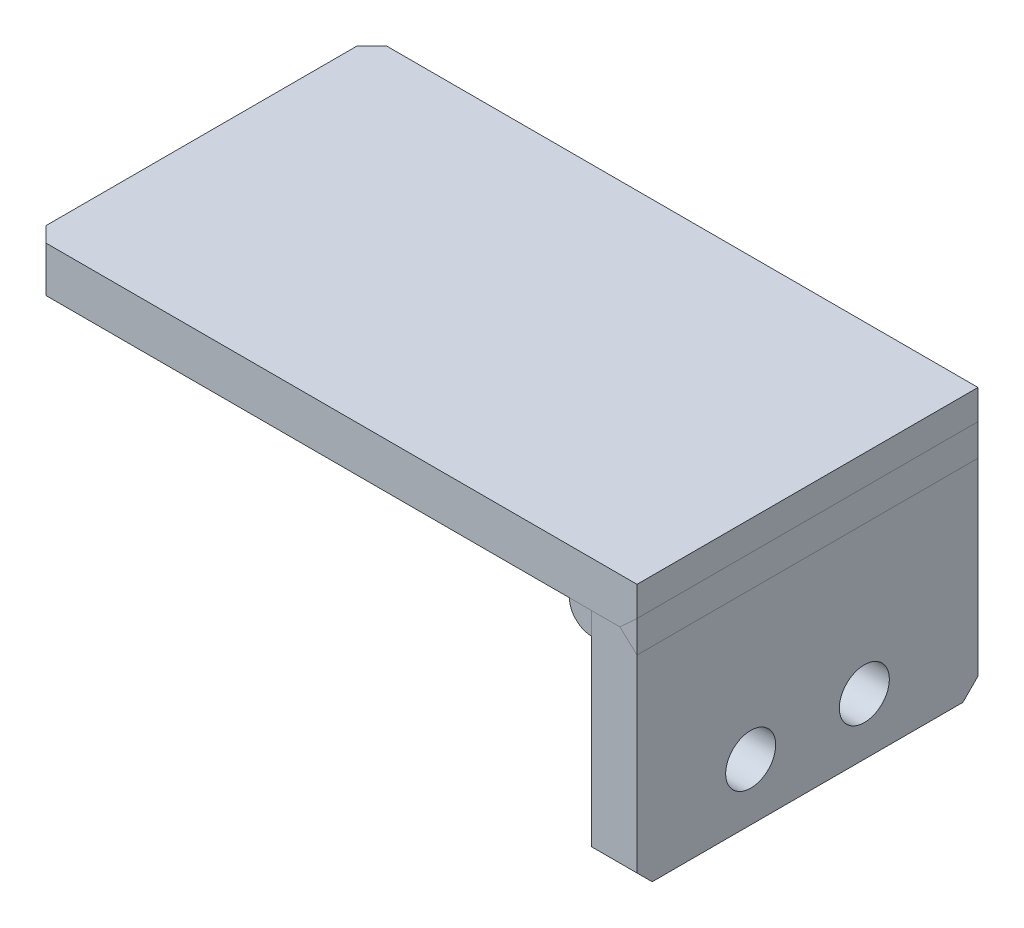
ISO-10303-21;
HEADER;
FILE_DESCRIPTION(('STEP AP214'),'2;1');
FILE_NAME('part.step','',(''),(''),'','','');
FILE_SCHEMA(('AUTOMOTIVE_DESIGN { 1 0 10303 214 1 1 1 1 }'));
ENDSEC;
DATA;
#1=APPLICATION_CONTEXT('core data for automotive mechanical design processes');
#2=APPLICATION_PROTOCOL_DEFINITION('international standard','automotive_design',2000,#1);
#3=PRODUCT_CONTEXT('',#1,'mechanical');
#4=PRODUCT('Part','Part','',(#3));
#5=PRODUCT_RELATED_PRODUCT_CATEGORY('part','',(#4));
#6=PRODUCT_DEFINITION_FORMATION('','',#4);
#7=PRODUCT_DEFINITION_CONTEXT('part definition',#1,'design');
#8=PRODUCT_DEFINITION('design','',#6,#7);
#9=PRODUCT_DEFINITION_SHAPE('','',#8);
#10=(LENGTH_UNIT() NAMED_UNIT(*) SI_UNIT(.MILLI.,.METRE.));
#11=(NAMED_UNIT(*) PLANE_ANGLE_UNIT() SI_UNIT($,.RADIAN.));
#12=(NAMED_UNIT(*) SI_UNIT($,.STERADIAN.) SOLID_ANGLE_UNIT());
#13=UNCERTAINTY_MEASURE_WITH_UNIT(LENGTH_MEASURE(1.E-05),#10,'distance_accuracy_value','');
#14=(GEOMETRIC_REPRESENTATION_CONTEXT(3) GLOBAL_UNCERTAINTY_ASSIGNED_CONTEXT((#13)) GLOBAL_UNIT_ASSIGNED_CONTEXT((#10,
#11,#12)) REPRESENTATION_CONTEXT('',''));
#15=CARTESIAN_POINT('',(0.,0.,0.));
#16=DIRECTION('',(0.,0.,1.));
#17=DIRECTION('',(1.,0.,0.));
#18=AXIS2_PLACEMENT_3D('',#15,#16,#17);
#19=CARTESIAN_POINT('',(77.7328439496423,-6.,-45.));
#20=DIRECTION('',(-0.678446943130279,0.734649403019685,0.));
#21=DIRECTION('',(-0.734649403019685,-0.678446943130279,0.));
#22=AXIS2_PLACEMENT_3D('',#19,#20,#21);
#23=PLANE('',#22);
#24=DIRECTION('',(-0.734649403019685,-0.678446943130279,0.));
#25=VECTOR('',#24,1.);
#26=CARTESIAN_POINT('',(77.7328439496423,-6.,0.));
#27=LINE('',#26,#25);
#28=CARTESIAN_POINT('',(80.,-3.90628688236577,0.));
#29=VERTEX_POINT('',#28);
#30=CARTESIAN_POINT('',(77.7328439496423,-6.,0.));
#31=VERTEX_POINT('',#30);
#32=EDGE_CURVE('E104',#29,#31,#27,.T.);
#33=ORIENTED_EDGE('',*,*,#32,.F.);
#34=DIRECTION('',(0.,0.,1.));
#35=VECTOR('',#34,1.);
#36=CARTESIAN_POINT('',(80.,-3.90628688236577,-45.));
#37=LINE('',#36,#35);
#38=CARTESIAN_POINT('',(80.,-3.90628688236577,-45.));
#39=VERTEX_POINT('',#38);
#40=EDGE_CURVE('E12',#39,#29,#37,.T.);
#41=ORIENTED_EDGE('',*,*,#40,.F.);
#42=DIRECTION('',(-0.734649403019685,-0.678446943130279,0.));
#43=VECTOR('',#42,1.);
#44=CARTESIAN_POINT('',(77.7328439496423,-6.,-45.));
#45=LINE('',#44,#43);
#46=CARTESIAN_POINT('',(77.7328439496423,-6.,-45.));
#47=VERTEX_POINT('',#46);
#48=EDGE_CURVE('E96',#39,#47,#45,.T.);
#49=ORIENTED_EDGE('',*,*,#48,.T.);
#50=DIRECTION('',(0.,0.,1.));
#51=VECTOR('',#50,1.);
#52=CARTESIAN_POINT('',(77.7328439496423,-6.,-45.));
#53=LINE('',#52,#51);
#54=EDGE_CURVE('E55',#47,#31,#53,.T.);
#55=ORIENTED_EDGE('',*,*,#54,.T.);
#56=EDGE_LOOP('',(#33,#41,#49,#55));
#57=FACE_BOUND('',#56,.T.);
#58=ADVANCED_FACE('F52',(#57),#23,.T.);
#59=CARTESIAN_POINT('',(80.,-3.90628688236577,-45.));
#60=DIRECTION('',(1.,0.,0.));
#61=DIRECTION('',(0.,0.,-1.));
#62=AXIS2_PLACEMENT_3D('',#59,#60,#61);
#63=PLANE('',#62);
#64=DIRECTION('',(0.,1.,0.));
#65=VECTOR('',#64,1.);
#66=CARTESIAN_POINT('',(80.,-3.90628688236577,0.));
#67=LINE('',#66,#65);
#68=CARTESIAN_POINT('',(80.,-8.08518038697702,0.));
#69=VERTEX_POINT('',#68);
#70=EDGE_CURVE('E98',#69,#29,#67,.T.);
#71=ORIENTED_EDGE('',*,*,#70,.F.);
#72=DIRECTION('',(0.,0.,1.));
#73=VECTOR('',#72,1.);
#74=CARTESIAN_POINT('',(80.,-8.08518038697702,-45.));
#75=LINE('',#74,#73);
#76=CARTESIAN_POINT('',(80.,-8.08518038697702,-45.));
#77=VERTEX_POINT('',#76);
#78=EDGE_CURVE('E61',#77,#69,#75,.T.);
#79=ORIENTED_EDGE('',*,*,#78,.F.);
#80=DIRECTION('',(0.,1.,0.));
#81=VECTOR('',#80,1.);
#82=CARTESIAN_POINT('',(80.,-3.90628688236577,-45.));
#83=LINE('',#82,#81);
#84=EDGE_CURVE('E93',#77,#39,#83,.T.);
#85=ORIENTED_EDGE('',*,*,#84,.T.);
#86=ORIENTED_EDGE('',*,*,#40,.T.);
#87=EDGE_LOOP('',(#71,#79,#85,#86));
#88=FACE_BOUND('',#87,.T.);
#89=ADVANCED_FACE('F108',(#88),#63,.T.);
#90=CARTESIAN_POINT('',(80.,-8.08518038697702,-45.));
#91=DIRECTION('',(-0.67695046810947,-0.736028575346344,0.));
#92=DIRECTION('',(0.736028575346344,-0.67695046810947,0.));
#93=AXIS2_PLACEMENT_3D('',#90,#91,#92);
#94=PLANE('',#93);
#95=DIRECTION('',(0.736028575346344,-0.67695046810947,0.));
#96=VECTOR('',#95,1.);
#97=CARTESIAN_POINT('',(80.,-8.08518038697702,0.));
#98=LINE('',#97,#96);
#99=EDGE_CURVE('E91',#31,#69,#98,.T.);
#100=ORIENTED_EDGE('',*,*,#99,.F.);
#101=ORIENTED_EDGE('',*,*,#54,.F.);
#102=DIRECTION('',(0.736028575346344,-0.67695046810947,0.));
#103=VECTOR('',#102,1.);
#104=CARTESIAN_POINT('',(80.,-8.08518038697702,-45.));
#105=LINE('',#104,#103);
#106=EDGE_CURVE('E89',#47,#77,#105,.T.);
#107=ORIENTED_EDGE('',*,*,#106,.T.);
#108=ORIENTED_EDGE('',*,*,#78,.T.);
#109=EDGE_LOOP('',(#100,#101,#107,#108));
#110=FACE_BOUND('',#109,.T.);
#111=ADVANCED_FACE('F88',(#110),#94,.T.);
#112=CARTESIAN_POINT('',(0.,0.,-45.));
#113=DIRECTION('',(0.,0.,1.));
#114=DIRECTION('',(1.,0.,0.));
#115=AXIS2_PLACEMENT_3D('',#112,#113,#114);
#116=PLANE('',#115);
#117=ORIENTED_EDGE('',*,*,#48,.F.);
#118=ORIENTED_EDGE('',*,*,#84,.F.);
#119=ORIENTED_EDGE('',*,*,#106,.F.);
#120=EDGE_LOOP('',(#117,#118,#119));
#121=FACE_BOUND('',#120,.T.);
#122=ADVANCED_FACE('F95',(#121),#116,.F.);
#123=CARTESIAN_POINT('',(0.,0.,0.));
#124=DIRECTION('',(0.,0.,1.));
#125=DIRECTION('',(1.,0.,0.));
#126=AXIS2_PLACEMENT_3D('',#123,#124,#125);
#127=PLANE('',#126);
#128=ORIENTED_EDGE('',*,*,#32,.T.);
#129=ORIENTED_EDGE('',*,*,#99,.T.);
#130=ORIENTED_EDGE('',*,*,#70,.T.);
#131=EDGE_LOOP('',(#128,#129,#130));
#132=FACE_BOUND('',#131,.T.);
#133=ADVANCED_FACE('F107',(#132),#127,.T.);
#134=CLOSED_SHELL('',(#58,#89,#111,#122,#133));
#135=MANIFOLD_SOLID_BREP('B2',#134);
#136=CARTESIAN_POINT('',(71.0801171016969,-6.,-45.));
#137=DIRECTION('',(0.,1.,0.));
#138=DIRECTION('',(0.,0.,1.));
#139=AXIS2_PLACEMENT_3D('',#136,#137,#138);
#140=PLANE('',#139);
#141=DIRECTION('',(-1.,0.,0.));
#142=VECTOR('',#141,1.);
#143=CARTESIAN_POINT('',(71.0801171016969,-6.,0.));
#144=LINE('',#143,#142);
#145=CARTESIAN_POINT('',(74.,-6.,0.));
#146=VERTEX_POINT('',#145);
#147=CARTESIAN_POINT('',(71.0801171016969,-6.,0.));
#148=VERTEX_POINT('',#147);
#149=EDGE_CURVE('E212',#146,#148,#144,.T.);
#150=ORIENTED_EDGE('',*,*,#149,.F.);
#151=DIRECTION('',(0.,0.,1.));
#152=VECTOR('',#151,1.);
#153=CARTESIAN_POINT('',(74.,-6.,-45.));
#154=LINE('',#153,#152);
#155=CARTESIAN_POINT('',(74.,-6.,-45.));
#156=VERTEX_POINT('',#155);
#157=EDGE_CURVE('E50',#156,#146,#154,.T.);
#158=ORIENTED_EDGE('',*,*,#157,.F.);
#159=DIRECTION('',(-1.,0.,0.));
#160=VECTOR('',#159,1.);
#161=CARTESIAN_POINT('',(71.0801171016969,-6.,-45.));
#162=LINE('',#161,#160);
#163=CARTESIAN_POINT('',(71.0801171016969,-6.,-45.));
#164=VERTEX_POINT('',#163);
#165=EDGE_CURVE('E204',#156,#164,#162,.T.);
#166=ORIENTED_EDGE('',*,*,#165,.T.);
#167=DIRECTION('',(0.,0.,1.));
#168=VECTOR('',#167,1.);
#169=CARTESIAN_POINT('',(71.0801171016969,-6.,-45.));
#170=LINE('',#169,#168);
#171=EDGE_CURVE('E163',#164,#148,#170,.T.);
#172=ORIENTED_EDGE('',*,*,#171,.T.);
#173=EDGE_LOOP('',(#150,#158,#166,#172));
#174=FACE_BOUND('',#173,.T.);
#175=ADVANCED_FACE('F160',(#174),#140,.T.);
#176=CARTESIAN_POINT('',(74.,-8.91988289830308,-45.));
#177=DIRECTION('',(1.,0.,0.));
#178=DIRECTION('',(0.,0.,-1.));
#179=AXIS2_PLACEMENT_3D('',#176,#177,#178);
#180=PLANE('',#179);
#181=DIRECTION('',(0.,1.,0.));
#182=VECTOR('',#181,1.);
#183=CARTESIAN_POINT('',(74.,-8.91988289830308,0.));
#184=LINE('',#183,#182);
#185=CARTESIAN_POINT('',(74.,-8.91988289830308,0.));
#186=VERTEX_POINT('',#185);
#187=EDGE_CURVE('E206',#186,#146,#184,.T.);
#188=ORIENTED_EDGE('',*,*,#187,.F.);
#189=DIRECTION('',(0.,0.,1.));
#190=VECTOR('',#189,1.);
#191=CARTESIAN_POINT('',(74.,-8.91988289830308,-45.));
#192=LINE('',#191,#190);
#193=CARTESIAN_POINT('',(74.,-8.91988289830308,-45.));
#194=VERTEX_POINT('',#193);
#195=EDGE_CURVE('E169',#194,#186,#192,.T.);
#196=ORIENTED_EDGE('',*,*,#195,.F.);
#197=DIRECTION('',(0.,1.,0.));
#198=VECTOR('',#197,1.);
#199=CARTESIAN_POINT('',(74.,-8.91988289830308,-45.));
#200=LINE('',#199,#198);
#201=EDGE_CURVE('E201',#194,#156,#200,.T.);
#202=ORIENTED_EDGE('',*,*,#201,.T.);
#203=ORIENTED_EDGE('',*,*,#157,.T.);
#204=EDGE_LOOP('',(#188,#196,#202,#203));
#205=FACE_BOUND('',#204,.T.);
#206=ADVANCED_FACE('F216',(#205),#180,.T.);
#207=CARTESIAN_POINT('',(74.,-6.,-45.));
#208=DIRECTION('',(0.,0.,1.));
#209=DIRECTION('',(1.,0.,0.));
#210=AXIS2_PLACEMENT_3D('',#207,#208,#209);
#211=CYLINDRICAL_SURFACE('',#210,2.91988289830307);
#212=CARTESIAN_POINT('',(74.,-6.,0.));
#213=DIRECTION('',(0.,0.,1.));
#214=DIRECTION('',(1.,0.,0.));
#215=AXIS2_PLACEMENT_3D('',#212,#213,#214);
#216=CIRCLE('',#215,2.91988289830307);
#217=EDGE_CURVE('E199',#148,#186,#216,.T.);
#218=ORIENTED_EDGE('',*,*,#217,.F.);
#219=ORIENTED_EDGE('',*,*,#171,.F.);
#220=CARTESIAN_POINT('',(74.,-6.,-45.));
#221=DIRECTION('',(0.,0.,1.));
#222=DIRECTION('',(1.,0.,0.));
#223=AXIS2_PLACEMENT_3D('',#220,#221,#222);
#224=CIRCLE('',#223,2.91988289830307);
#225=EDGE_CURVE('E197',#164,#194,#224,.T.);
#226=ORIENTED_EDGE('',*,*,#225,.T.);
#227=ORIENTED_EDGE('',*,*,#195,.T.);
#228=EDGE_LOOP('',(#218,#219,#226,#227));
#229=FACE_BOUND('',#228,.T.);
#230=ADVANCED_FACE('F196',(#229),#211,.T.);
#231=CARTESIAN_POINT('',(74.,-6.,-45.));
#232=DIRECTION('',(0.,0.,1.));
#233=DIRECTION('',(1.,0.,0.));
#234=AXIS2_PLACEMENT_3D('',#231,#232,#233);
#235=PLANE('',#234);
#236=ORIENTED_EDGE('',*,*,#165,.F.);
#237=ORIENTED_EDGE('',*,*,#201,.F.);
#238=ORIENTED_EDGE('',*,*,#225,.F.);
#239=EDGE_LOOP('',(#236,#237,#238));
#240=FACE_BOUND('',#239,.T.);
#241=ADVANCED_FACE('F203',(#240),#235,.F.);
#242=CARTESIAN_POINT('',(74.,-6.,0.));
#243=DIRECTION('',(0.,0.,1.));
#244=DIRECTION('',(1.,0.,0.));
#245=AXIS2_PLACEMENT_3D('',#242,#243,#244);
#246=PLANE('',#245);
#247=ORIENTED_EDGE('',*,*,#149,.T.);
#248=ORIENTED_EDGE('',*,*,#217,.T.);
#249=ORIENTED_EDGE('',*,*,#187,.T.);
#250=EDGE_LOOP('',(#247,#248,#249));
#251=FACE_BOUND('',#250,.T.);
#252=ADVANCED_FACE('F215',(#251),#246,.T.);
#253=CLOSED_SHELL('',(#175,#206,#230,#241,#252));
#254=MANIFOLD_SOLID_BREP('B6',#253);
#255=CARTESIAN_POINT('',(80.,-35.,0.));
#256=DIRECTION('',(-1.,0.,0.));
#257=DIRECTION('',(0.,0.,1.));
#258=AXIS2_PLACEMENT_3D('',#255,#256,#257);
#259=PLANE('',#258);
#260=CARTESIAN_POINT('',(80.,-27.5,-15.));
#261=DIRECTION('',(1.,0.,0.));
#262=DIRECTION('',(0.,0.,-1.));
#263=AXIS2_PLACEMENT_3D('',#260,#261,#262);
#264=CIRCLE('',#263,3.3);
#265=CARTESIAN_POINT('',(80.,-27.5,-18.3));
#266=VERTEX_POINT('',#265);
#267=EDGE_CURVE('E378',#266,#266,#264,.T.);
#268=ORIENTED_EDGE('',*,*,#267,.F.);
#269=EDGE_LOOP('',(#268));
#270=FACE_BOUND('',#269,.T.);
#271=CARTESIAN_POINT('',(80.,-27.5,-30.));
#272=DIRECTION('',(1.,0.,0.));
#273=DIRECTION('',(0.,0.,-1.));
#274=AXIS2_PLACEMENT_3D('',#271,#272,#273);
#275=CIRCLE('',#274,3.3);
#276=CARTESIAN_POINT('',(80.,-27.5,-33.3));
#277=VERTEX_POINT('',#276);
#278=EDGE_CURVE('E355',#277,#277,#275,.T.);
#279=ORIENTED_EDGE('',*,*,#278,.F.);
#280=EDGE_LOOP('',(#279));
#281=FACE_BOUND('',#280,.T.);
#282=DIRECTION('',(0.,0.,1.));
#283=VECTOR('',#282,1.);
#284=CARTESIAN_POINT('',(80.,-35.,0.));
#285=LINE('',#284,#283);
#286=CARTESIAN_POINT('',(80.,-35.,-43.));
#287=VERTEX_POINT('',#286);
#288=CARTESIAN_POINT('',(80.,-35.,-2.));
#289=VERTEX_POINT('',#288);
#290=EDGE_CURVE('E358',#287,#289,#285,.T.);
#291=ORIENTED_EDGE('',*,*,#290,.F.);
#292=DIRECTION('',(0.,-0.707106781186549,0.707106781186546));
#293=VECTOR('',#292,1.);
#294=CARTESIAN_POINT('',(80.,-35.,-43.));
#295=LINE('',#294,#293);
#296=CARTESIAN_POINT('',(80.,-33.,-45.));
#297=VERTEX_POINT('',#296);
#298=EDGE_CURVE('E331',#287,#297,#295,.F.);
#299=ORIENTED_EDGE('',*,*,#298,.T.);
#300=DIRECTION('',(0.,1.,0.));
#301=VECTOR('',#300,1.);
#302=CARTESIAN_POINT('',(80.,-35.,-45.));
#303=LINE('',#302,#301);
#304=CARTESIAN_POINT('',(80.,-8.08518038697702,-45.));
#305=VERTEX_POINT('',#304);
#306=EDGE_CURVE('E326',#297,#305,#303,.T.);
#307=ORIENTED_EDGE('',*,*,#306,.T.);
#308=DIRECTION('',(0.,0.,1.));
#309=VECTOR('',#308,1.);
#310=CARTESIAN_POINT('',(80.,-8.08518038697702,-45.));
#311=LINE('',#310,#309);
#312=CARTESIAN_POINT('',(80.,-8.08518038697702,0.));
#313=VERTEX_POINT('',#312);
#314=EDGE_CURVE('E330',#305,#313,#311,.T.);
#315=ORIENTED_EDGE('',*,*,#314,.T.);
#316=DIRECTION('',(0.,1.,0.));
#317=VECTOR('',#316,1.);
#318=CARTESIAN_POINT('',(80.,-35.,0.));
#319=LINE('',#318,#317);
#320=CARTESIAN_POINT('',(80.,-33.,0.));
#321=VERTEX_POINT('',#320);
#322=EDGE_CURVE('E372',#321,#313,#319,.T.);
#323=ORIENTED_EDGE('',*,*,#322,.F.);
#324=DIRECTION('',(0.,0.707106781186549,0.707106781186546));
#325=VECTOR('',#324,1.);
#326=CARTESIAN_POINT('',(80.,-35.,-2.));
#327=LINE('',#326,#325);
#328=EDGE_CURVE('E386',#321,#289,#327,.F.);
#329=ORIENTED_EDGE('',*,*,#328,.T.);
#330=EDGE_LOOP('',(#291,#299,#307,#315,#323,#329));
#331=FACE_BOUND('',#330,.T.);
#332=ADVANCED_FACE('F267',(#270,#281,#331),#259,.F.);
#333=CARTESIAN_POINT('',(80.,-35.,0.));
#334=DIRECTION('',(0.,0.,-1.));
#335=DIRECTION('',(-1.,0.,0.));
#336=AXIS2_PLACEMENT_3D('',#333,#334,#335);
#337=PLANE('',#336);
#338=DIRECTION('',(0.,1.,0.));
#339=VECTOR('',#338,1.);
#340=CARTESIAN_POINT('',(74.,-35.,0.));
#341=LINE('',#340,#339);
#342=CARTESIAN_POINT('',(74.,-33.,0.));
#343=VERTEX_POINT('',#342);
#344=CARTESIAN_POINT('',(74.,-6.,0.));
#345=VERTEX_POINT('',#344);
#346=EDGE_CURVE('E370',#343,#345,#341,.T.);
#347=ORIENTED_EDGE('',*,*,#346,.F.);
#348=DIRECTION('',(1.,0.,0.));
#349=VECTOR('',#348,1.);
#350=CARTESIAN_POINT('',(80.,-33.,0.));
#351=LINE('',#350,#349);
#352=EDGE_CURVE('E158',#343,#321,#351,.T.);
#353=ORIENTED_EDGE('',*,*,#352,.T.);
#354=ORIENTED_EDGE('',*,*,#322,.T.);
#355=DIRECTION('',(0.736028575346344,-0.67695046810947,0.));
#356=VECTOR('',#355,1.);
#357=CARTESIAN_POINT('',(80.,-8.08518038697702,0.));
#358=LINE('',#357,#356);
#359=CARTESIAN_POINT('',(77.7328439496423,-6.,0.));
#360=VERTEX_POINT('',#359);
#361=EDGE_CURVE('E342',#360,#313,#358,.T.);
#362=ORIENTED_EDGE('',*,*,#361,.F.);
#363=DIRECTION('',(-1.,0.,0.));
#364=VECTOR('',#363,1.);
#365=CARTESIAN_POINT('',(80.,-6.,0.));
#366=LINE('',#365,#364);
#367=EDGE_CURVE('E343',#360,#345,#366,.T.);
#368=ORIENTED_EDGE('',*,*,#367,.T.);
#369=EDGE_LOOP('',(#347,#353,#354,#362,#368));
#370=FACE_BOUND('',#369,.T.);
#371=ADVANCED_FACE('F411',(#370),#337,.F.);
#372=CARTESIAN_POINT('',(74.,-35.,0.));
#373=DIRECTION('',(1.,0.,0.));
#374=DIRECTION('',(0.,0.,-1.));
#375=AXIS2_PLACEMENT_3D('',#372,#373,#374);
#376=PLANE('',#375);
#377=CARTESIAN_POINT('',(74.,-27.5,-15.));
#378=DIRECTION('',(1.,0.,0.));
#379=DIRECTION('',(0.,0.,-1.));
#380=AXIS2_PLACEMENT_3D('',#377,#378,#379);
#381=CIRCLE('',#380,3.3);
#382=CARTESIAN_POINT('',(74.,-27.5,-18.3));
#383=VERTEX_POINT('',#382);
#384=EDGE_CURVE('E352',#383,#383,#381,.T.);
#385=ORIENTED_EDGE('',*,*,#384,.T.);
#386=EDGE_LOOP('',(#385));
#387=FACE_BOUND('',#386,.T.);
#388=CARTESIAN_POINT('',(74.,-27.5,-30.));
#389=DIRECTION('',(1.,0.,0.));
#390=DIRECTION('',(0.,0.,-1.));
#391=AXIS2_PLACEMENT_3D('',#388,#389,#390);
#392=CIRCLE('',#391,3.3);
#393=CARTESIAN_POINT('',(74.,-27.5,-33.3));
#394=VERTEX_POINT('',#393);
#395=EDGE_CURVE('E375',#394,#394,#392,.T.);
#396=ORIENTED_EDGE('',*,*,#395,.T.);
#397=EDGE_LOOP('',(#396));
#398=FACE_BOUND('',#397,.T.);
#399=DIRECTION('',(0.,1.,0.));
#400=VECTOR('',#399,1.);
#401=CARTESIAN_POINT('',(74.,-35.,-45.));
#402=LINE('',#401,#400);
#403=CARTESIAN_POINT('',(74.,-33.,-45.));
#404=VERTEX_POINT('',#403);
#405=CARTESIAN_POINT('',(74.,-6.,-45.));
#406=VERTEX_POINT('',#405);
#407=EDGE_CURVE('E333',#404,#406,#402,.T.);
#408=ORIENTED_EDGE('',*,*,#407,.F.);
#409=DIRECTION('',(0.,0.707106781186549,-0.707106781186546));
#410=VECTOR('',#409,1.);
#411=CARTESIAN_POINT('',(74.,-35.,-43.));
#412=LINE('',#411,#410);
#413=CARTESIAN_POINT('',(74.,-35.,-43.));
#414=VERTEX_POINT('',#413);
#415=EDGE_CURVE('E276',#404,#414,#412,.F.);
#416=ORIENTED_EDGE('',*,*,#415,.T.);
#417=DIRECTION('',(0.,0.,-1.));
#418=VECTOR('',#417,1.);
#419=CARTESIAN_POINT('',(74.,-35.,0.));
#420=LINE('',#419,#418);
#421=CARTESIAN_POINT('',(74.,-35.,-2.));
#422=VERTEX_POINT('',#421);
#423=EDGE_CURVE('E334',#422,#414,#420,.T.);
#424=ORIENTED_EDGE('',*,*,#423,.F.);
#425=DIRECTION('',(0.,-0.707106781186549,-0.707106781186546));
#426=VECTOR('',#425,1.);
#427=CARTESIAN_POINT('',(74.,-35.,-2.));
#428=LINE('',#427,#426);
#429=EDGE_CURVE('E283',#422,#343,#428,.F.);
#430=ORIENTED_EDGE('',*,*,#429,.T.);
#431=ORIENTED_EDGE('',*,*,#346,.T.);
#432=DIRECTION('',(0.,0.,-1.));
#433=VECTOR('',#432,1.);
#434=CARTESIAN_POINT('',(74.,-6.,0.));
#435=LINE('',#434,#433);
#436=EDGE_CURVE('E365',#345,#406,#435,.T.);
#437=ORIENTED_EDGE('',*,*,#436,.T.);
#438=EDGE_LOOP('',(#408,#416,#424,#430,#431,#437));
#439=FACE_BOUND('',#438,.T.);
#440=ADVANCED_FACE('F391',(#387,#398,#439),#376,.F.);
#441=CARTESIAN_POINT('',(80.,-35.,-45.));
#442=DIRECTION('',(0.,0.,1.));
#443=DIRECTION('',(1.,0.,0.));
#444=AXIS2_PLACEMENT_3D('',#441,#442,#443);
#445=PLANE('',#444);
#446=ORIENTED_EDGE('',*,*,#306,.F.);
#447=DIRECTION('',(-1.,0.,0.));
#448=VECTOR('',#447,1.);
#449=CARTESIAN_POINT('',(80.,-33.,-45.));
#450=LINE('',#449,#448);
#451=EDGE_CURVE('E291',#297,#404,#450,.T.);
#452=ORIENTED_EDGE('',*,*,#451,.T.);
#453=ORIENTED_EDGE('',*,*,#407,.T.);
#454=DIRECTION('',(1.,0.,0.));
#455=VECTOR('',#454,1.);
#456=CARTESIAN_POINT('',(80.,-6.,-45.));
#457=LINE('',#456,#455);
#458=CARTESIAN_POINT('',(77.7328439496423,-6.,-45.));
#459=VERTEX_POINT('',#458);
#460=EDGE_CURVE('E349',#406,#459,#457,.T.);
#461=ORIENTED_EDGE('',*,*,#460,.T.);
#462=DIRECTION('',(0.736028575346344,-0.67695046810947,0.));
#463=VECTOR('',#462,1.);
#464=CARTESIAN_POINT('',(80.,-8.08518038697702,-45.));
#465=LINE('',#464,#463);
#466=EDGE_CURVE('E339',#459,#305,#465,.T.);
#467=ORIENTED_EDGE('',*,*,#466,.T.);
#468=EDGE_LOOP('',(#446,#452,#453,#461,#467));
#469=FACE_BOUND('',#468,.T.);
#470=ADVANCED_FACE('F347',(#469),#445,.F.);
#471=CARTESIAN_POINT('',(0.,-35.,0.));
#472=DIRECTION('',(0.,1.,0.));
#473=DIRECTION('',(0.,0.,1.));
#474=AXIS2_PLACEMENT_3D('',#471,#472,#473);
#475=PLANE('',#474);
#476=ORIENTED_EDGE('',*,*,#423,.T.);
#477=DIRECTION('',(1.,0.,0.));
#478=VECTOR('',#477,1.);
#479=CARTESIAN_POINT('',(0.,-35.,-43.));
#480=LINE('',#479,#478);
#481=EDGE_CURVE('E383',#414,#287,#480,.T.);
#482=ORIENTED_EDGE('',*,*,#481,.T.);
#483=ORIENTED_EDGE('',*,*,#290,.T.);
#484=DIRECTION('',(-1.,0.,0.));
#485=VECTOR('',#484,1.);
#486=CARTESIAN_POINT('',(0.,-35.,-2.));
#487=LINE('',#486,#485);
#488=EDGE_CURVE('E374',#289,#422,#487,.T.);
#489=ORIENTED_EDGE('',*,*,#488,.T.);
#490=EDGE_LOOP('',(#476,#482,#483,#489));
#491=FACE_BOUND('',#490,.T.);
#492=ADVANCED_FACE('F395',(#491),#475,.F.);
#493=CARTESIAN_POINT('',(0.,-6.,0.));
#494=DIRECTION('',(0.,1.,0.));
#495=DIRECTION('',(0.,0.,1.));
#496=AXIS2_PLACEMENT_3D('',#493,#494,#495);
#497=PLANE('',#496);
#498=DIRECTION('',(0.,0.,1.));
#499=VECTOR('',#498,1.);
#500=CARTESIAN_POINT('',(77.7328439496423,-6.,-45.));
#501=LINE('',#500,#499);
#502=EDGE_CURVE('E344',#459,#360,#501,.T.);
#503=ORIENTED_EDGE('',*,*,#502,.F.);
#504=ORIENTED_EDGE('',*,*,#460,.F.);
#505=ORIENTED_EDGE('',*,*,#436,.F.);
#506=ORIENTED_EDGE('',*,*,#367,.F.);
#507=EDGE_LOOP('',(#503,#504,#505,#506));
#508=FACE_BOUND('',#507,.T.);
#509=ADVANCED_FACE('F426',(#508),#497,.T.);
#510=CARTESIAN_POINT('',(80.,-8.08518038697702,-45.));
#511=DIRECTION('',(-0.67695046810947,-0.736028575346344,0.));
#512=DIRECTION('',(0.736028575346344,-0.67695046810947,0.));
#513=AXIS2_PLACEMENT_3D('',#510,#511,#512);
#514=PLANE('',#513);
#515=ORIENTED_EDGE('',*,*,#361,.T.);
#516=ORIENTED_EDGE('',*,*,#314,.F.);
#517=ORIENTED_EDGE('',*,*,#466,.F.);
#518=ORIENTED_EDGE('',*,*,#502,.T.);
#519=EDGE_LOOP('',(#515,#516,#517,#518));
#520=FACE_BOUND('',#519,.T.);
#521=ADVANCED_FACE('F338',(#520),#514,.F.);
#522=CARTESIAN_POINT('',(0.,-27.5,-30.));
#523=DIRECTION('',(1.,0.,0.));
#524=DIRECTION('',(0.,0.,-1.));
#525=AXIS2_PLACEMENT_3D('',#522,#523,#524);
#526=CYLINDRICAL_SURFACE('',#525,3.3);
#527=ORIENTED_EDGE('',*,*,#278,.T.);
#528=EDGE_LOOP('',(#527));
#529=FACE_BOUND('',#528,.T.);
#530=ORIENTED_EDGE('',*,*,#395,.F.);
#531=EDGE_LOOP('',(#530));
#532=FACE_BOUND('',#531,.T.);
#533=ADVANCED_FACE('F405',(#529,#532),#526,.F.);
#534=CARTESIAN_POINT('',(0.,-27.5,-15.));
#535=DIRECTION('',(1.,0.,0.));
#536=DIRECTION('',(0.,0.,-1.));
#537=AXIS2_PLACEMENT_3D('',#534,#535,#536);
#538=CYLINDRICAL_SURFACE('',#537,3.3);
#539=ORIENTED_EDGE('',*,*,#267,.T.);
#540=EDGE_LOOP('',(#539));
#541=FACE_BOUND('',#540,.T.);
#542=ORIENTED_EDGE('',*,*,#384,.F.);
#543=EDGE_LOOP('',(#542));
#544=FACE_BOUND('',#543,.T.);
#545=ADVANCED_FACE('F399',(#541,#544),#538,.F.);
#546=CARTESIAN_POINT('',(0.,-35.,-43.));
#547=DIRECTION('',(0.,0.707106781186546,0.707106781186549));
#548=DIRECTION('',(1.,0.,0.));
#549=AXIS2_PLACEMENT_3D('',#546,#547,#548);
#550=PLANE('',#549);
#551=ORIENTED_EDGE('',*,*,#415,.F.);
#552=ORIENTED_EDGE('',*,*,#451,.F.);
#553=ORIENTED_EDGE('',*,*,#298,.F.);
#554=ORIENTED_EDGE('',*,*,#481,.F.);
#555=EDGE_LOOP('',(#551,#552,#553,#554));
#556=FACE_BOUND('',#555,.T.);
#557=ADVANCED_FACE('F397',(#556),#550,.F.);
#558=CARTESIAN_POINT('',(0.,-35.,-2.));
#559=DIRECTION('',(0.,0.707106781186546,-0.707106781186549));
#560=DIRECTION('',(-1.,0.,0.));
#561=AXIS2_PLACEMENT_3D('',#558,#559,#560);
#562=PLANE('',#561);
#563=ORIENTED_EDGE('',*,*,#328,.F.);
#564=ORIENTED_EDGE('',*,*,#352,.F.);
#565=ORIENTED_EDGE('',*,*,#429,.F.);
#566=ORIENTED_EDGE('',*,*,#488,.F.);
#567=EDGE_LOOP('',(#563,#564,#565,#566));
#568=FACE_BOUND('',#567,.T.);
#569=ADVANCED_FACE('F270',(#568),#562,.F.);
#570=CLOSED_SHELL('',(#332,#371,#440,#470,#492,#509,#521,#533,#545,#557,#569));
#571=MANIFOLD_SOLID_BREP('B44',#570);
#572=CARTESIAN_POINT('',(0.,-6.,0.));
#573=DIRECTION('',(-1.,0.,0.));
#574=DIRECTION('',(0.,0.,1.));
#575=AXIS2_PLACEMENT_3D('',#572,#573,#574);
#576=PLANE('',#575);
#577=DIRECTION('',(0.,0.,1.));
#578=VECTOR('',#577,1.);
#579=CARTESIAN_POINT('',(0.,-6.,0.));
#580=LINE('',#579,#578);
#581=CARTESIAN_POINT('',(0.,-6.,-43.));
#582=VERTEX_POINT('',#581);
#583=CARTESIAN_POINT('',(0.,-6.,-2.));
#584=VERTEX_POINT('',#583);
#585=EDGE_CURVE('E605',#582,#584,#580,.T.);
#586=ORIENTED_EDGE('',*,*,#585,.T.);
#587=DIRECTION('',(0.,1.,0.));
#588=VECTOR('',#587,1.);
#589=CARTESIAN_POINT('',(0.,-6.,-2.));
#590=LINE('',#589,#588);
#591=CARTESIAN_POINT('',(0.,0.,-2.));
#592=VERTEX_POINT('',#591);
#593=EDGE_CURVE('E630',#584,#592,#590,.T.);
#594=ORIENTED_EDGE('',*,*,#593,.T.);
#595=DIRECTION('',(0.,0.,1.));
#596=VECTOR('',#595,1.);
#597=CARTESIAN_POINT('',(0.,0.,0.));
#598=LINE('',#597,#596);
#599=CARTESIAN_POINT('',(0.,0.,-43.));
#600=VERTEX_POINT('',#599);
#601=EDGE_CURVE('E609',#600,#592,#598,.T.);
#602=ORIENTED_EDGE('',*,*,#601,.F.);
#603=DIRECTION('',(0.,-1.,0.));
#604=VECTOR('',#603,1.);
#605=CARTESIAN_POINT('',(0.,-6.,-43.));
#606=LINE('',#605,#604);
#607=EDGE_CURVE('E626',#600,#582,#606,.T.);
#608=ORIENTED_EDGE('',*,*,#607,.T.);
#609=EDGE_LOOP('',(#586,#594,#602,#608));
#610=FACE_BOUND('',#609,.T.);
#611=ADVANCED_FACE('F517',(#610),#576,.T.);
#612=CARTESIAN_POINT('',(0.,-6.,-45.));
#613=DIRECTION('',(0.,0.,-1.));
#614=DIRECTION('',(-1.,0.,0.));
#615=AXIS2_PLACEMENT_3D('',#612,#613,#614);
#616=PLANE('',#615);
#617=DIRECTION('',(-0.734649403019685,-0.678446943130279,0.));
#618=VECTOR('',#617,1.);
#619=CARTESIAN_POINT('',(77.7328439496423,-6.,-45.));
#620=LINE('',#619,#618);
#621=CARTESIAN_POINT('',(80.,-3.90628688236577,-45.));
#622=VERTEX_POINT('',#621);
#623=CARTESIAN_POINT('',(77.7328439496423,-6.,-45.));
#624=VERTEX_POINT('',#623);
#625=EDGE_CURVE('E581',#622,#624,#620,.T.);
#626=ORIENTED_EDGE('',*,*,#625,.T.);
#627=DIRECTION('',(-1.,0.,0.));
#628=VECTOR('',#627,1.);
#629=CARTESIAN_POINT('',(0.,-6.,-45.));
#630=LINE('',#629,#628);
#631=CARTESIAN_POINT('',(2.,-6.,-45.));
#632=VERTEX_POINT('',#631);
#633=EDGE_CURVE('E541',#624,#632,#630,.T.);
#634=ORIENTED_EDGE('',*,*,#633,.T.);
#635=DIRECTION('',(0.,1.,0.));
#636=VECTOR('',#635,1.);
#637=CARTESIAN_POINT('',(2.,-6.,-45.));
#638=LINE('',#637,#636);
#639=CARTESIAN_POINT('',(2.,0.,-45.));
#640=VERTEX_POINT('',#639);
#641=EDGE_CURVE('E265',#632,#640,#638,.T.);
#642=ORIENTED_EDGE('',*,*,#641,.T.);
#643=DIRECTION('',(-1.,0.,0.));
#644=VECTOR('',#643,1.);
#645=CARTESIAN_POINT('',(0.,0.,-45.));
#646=LINE('',#645,#644);
#647=CARTESIAN_POINT('',(80.,0.,-45.));
#648=VERTEX_POINT('',#647);
#649=EDGE_CURVE('E621',#648,#640,#646,.T.);
#650=ORIENTED_EDGE('',*,*,#649,.F.);
#651=DIRECTION('',(0.,1.,0.));
#652=VECTOR('',#651,1.);
#653=CARTESIAN_POINT('',(80.,-6.,-45.));
#654=LINE('',#653,#652);
#655=EDGE_CURVE('E591',#622,#648,#654,.T.);
#656=ORIENTED_EDGE('',*,*,#655,.F.);
#657=EDGE_LOOP('',(#626,#634,#642,#650,#656));
#658=FACE_BOUND('',#657,.T.);
#659=ADVANCED_FACE('F589',(#658),#616,.T.);
#660=CARTESIAN_POINT('',(80.,-6.,0.));
#661=DIRECTION('',(1.,0.,0.));
#662=DIRECTION('',(0.,0.,-1.));
#663=AXIS2_PLACEMENT_3D('',#660,#661,#662);
#664=PLANE('',#663);
#665=DIRECTION('',(0.,0.,1.));
#666=VECTOR('',#665,1.);
#667=CARTESIAN_POINT('',(80.,-3.90628688236577,-45.));
#668=LINE('',#667,#666);
#669=CARTESIAN_POINT('',(80.,-3.90628688236577,0.));
#670=VERTEX_POINT('',#669);
#671=EDGE_CURVE('E586',#622,#670,#668,.T.);
#672=ORIENTED_EDGE('',*,*,#671,.F.);
#673=ORIENTED_EDGE('',*,*,#655,.T.);
#674=DIRECTION('',(0.,0.,-1.));
#675=VECTOR('',#674,1.);
#676=CARTESIAN_POINT('',(80.,0.,0.));
#677=LINE('',#676,#675);
#678=CARTESIAN_POINT('',(80.,0.,0.));
#679=VERTEX_POINT('',#678);
#680=EDGE_CURVE('E617',#679,#648,#677,.T.);
#681=ORIENTED_EDGE('',*,*,#680,.F.);
#682=DIRECTION('',(0.,1.,0.));
#683=VECTOR('',#682,1.);
#684=CARTESIAN_POINT('',(80.,-6.,0.));
#685=LINE('',#684,#683);
#686=EDGE_CURVE('E600',#670,#679,#685,.T.);
#687=ORIENTED_EDGE('',*,*,#686,.F.);
#688=EDGE_LOOP('',(#672,#673,#681,#687));
#689=FACE_BOUND('',#688,.T.);
#690=ADVANCED_FACE('F662',(#689),#664,.T.);
#691=CARTESIAN_POINT('',(0.,-6.,0.));
#692=DIRECTION('',(0.,0.,1.));
#693=DIRECTION('',(1.,0.,0.));
#694=AXIS2_PLACEMENT_3D('',#691,#692,#693);
#695=PLANE('',#694);
#696=DIRECTION('',(-0.734649403019685,-0.678446943130279,0.));
#697=VECTOR('',#696,1.);
#698=CARTESIAN_POINT('',(77.7328439496423,-6.,0.));
#699=LINE('',#698,#697);
#700=CARTESIAN_POINT('',(77.7328439496423,-6.,0.));
#701=VERTEX_POINT('',#700);
#702=EDGE_CURVE('E583',#670,#701,#699,.T.);
#703=ORIENTED_EDGE('',*,*,#702,.F.);
#704=ORIENTED_EDGE('',*,*,#686,.T.);
#705=DIRECTION('',(1.,0.,0.));
#706=VECTOR('',#705,1.);
#707=CARTESIAN_POINT('',(0.,0.,0.));
#708=LINE('',#707,#706);
#709=CARTESIAN_POINT('',(2.00000000000002,0.,0.));
#710=VERTEX_POINT('',#709);
#711=EDGE_CURVE('E613',#710,#679,#708,.T.);
#712=ORIENTED_EDGE('',*,*,#711,.F.);
#713=DIRECTION('',(0.,-1.,0.));
#714=VECTOR('',#713,1.);
#715=CARTESIAN_POINT('',(2.00000000000002,-6.,0.));
#716=LINE('',#715,#714);
#717=CARTESIAN_POINT('',(2.00000000000002,-6.,0.));
#718=VERTEX_POINT('',#717);
#719=EDGE_CURVE('E640',#710,#718,#716,.T.);
#720=ORIENTED_EDGE('',*,*,#719,.T.);
#721=DIRECTION('',(1.,0.,0.));
#722=VECTOR('',#721,1.);
#723=CARTESIAN_POINT('',(0.,-6.,0.));
#724=LINE('',#723,#722);
#725=EDGE_CURVE('E534',#718,#701,#724,.T.);
#726=ORIENTED_EDGE('',*,*,#725,.T.);
#727=EDGE_LOOP('',(#703,#704,#712,#720,#726));
#728=FACE_BOUND('',#727,.T.);
#729=ADVANCED_FACE('F659',(#728),#695,.T.);
#730=CARTESIAN_POINT('',(0.,-6.,0.));
#731=DIRECTION('',(0.,-1.,0.));
#732=DIRECTION('',(0.,0.,-1.));
#733=AXIS2_PLACEMENT_3D('',#730,#731,#732);
#734=PLANE('',#733);
#735=DIRECTION('',(0.,0.,1.));
#736=VECTOR('',#735,1.);
#737=CARTESIAN_POINT('',(77.7328439496423,-6.,-45.));
#738=LINE('',#737,#736);
#739=EDGE_CURVE('E579',#624,#701,#738,.T.);
#740=ORIENTED_EDGE('',*,*,#739,.T.);
#741=ORIENTED_EDGE('',*,*,#725,.F.);
#742=DIRECTION('',(0.70710678118655,0.,0.707106781186545));
#743=VECTOR('',#742,1.);
#744=CARTESIAN_POINT('',(1.,-6.,-1.00000000000001));
#745=LINE('',#744,#743);
#746=EDGE_CURVE('E527',#718,#584,#745,.F.);
#747=ORIENTED_EDGE('',*,*,#746,.T.);
#748=ORIENTED_EDGE('',*,*,#585,.F.);
#749=DIRECTION('',(-0.707106781186545,0.,0.70710678118655));
#750=VECTOR('',#749,1.);
#751=CARTESIAN_POINT('',(-21.5,-6.,-21.4999999999998));
#752=LINE('',#751,#750);
#753=EDGE_CURVE('E597',#582,#632,#752,.F.);
#754=ORIENTED_EDGE('',*,*,#753,.T.);
#755=ORIENTED_EDGE('',*,*,#633,.F.);
#756=EDGE_LOOP('',(#740,#741,#747,#748,#754,#755));
#757=FACE_BOUND('',#756,.T.);
#758=ADVANCED_FACE('F594',(#757),#734,.T.);
#759=CARTESIAN_POINT('',(0.,0.,0.));
#760=DIRECTION('',(0.,-1.,0.));
#761=DIRECTION('',(0.,0.,-1.));
#762=AXIS2_PLACEMENT_3D('',#759,#760,#761);
#763=PLANE('',#762);
#764=ORIENTED_EDGE('',*,*,#601,.T.);
#765=DIRECTION('',(-0.70710678118655,0.,-0.707106781186545));
#766=VECTOR('',#765,1.);
#767=CARTESIAN_POINT('',(0.,0.,-2.));
#768=LINE('',#767,#766);
#769=EDGE_CURVE('E637',#592,#710,#768,.F.);
#770=ORIENTED_EDGE('',*,*,#769,.T.);
#771=ORIENTED_EDGE('',*,*,#711,.T.);
#772=ORIENTED_EDGE('',*,*,#680,.T.);
#773=ORIENTED_EDGE('',*,*,#649,.T.);
#774=DIRECTION('',(0.707106781186545,0.,-0.70710678118655));
#775=VECTOR('',#774,1.);
#776=CARTESIAN_POINT('',(2.,0.,-45.));
#777=LINE('',#776,#775);
#778=EDGE_CURVE('E634',#640,#600,#777,.F.);
#779=ORIENTED_EDGE('',*,*,#778,.T.);
#780=EDGE_LOOP('',(#764,#770,#771,#772,#773,#779));
#781=FACE_BOUND('',#780,.T.);
#782=ADVANCED_FACE('F657',(#781),#763,.F.);
#783=CARTESIAN_POINT('',(0.,-6.,-2.));
#784=DIRECTION('',(0.707106781186545,0.,-0.70710678118655));
#785=DIRECTION('',(0.,1.,0.));
#786=AXIS2_PLACEMENT_3D('',#783,#784,#785);
#787=PLANE('',#786);
#788=ORIENTED_EDGE('',*,*,#746,.F.);
#789=ORIENTED_EDGE('',*,*,#719,.F.);
#790=ORIENTED_EDGE('',*,*,#769,.F.);
#791=ORIENTED_EDGE('',*,*,#593,.F.);
#792=EDGE_LOOP('',(#788,#789,#790,#791));
#793=FACE_BOUND('',#792,.T.);
#794=ADVANCED_FACE('F654',(#793),#787,.F.);
#795=CARTESIAN_POINT('',(2.,-6.,-45.));
#796=DIRECTION('',(0.70710678118655,0.,0.707106781186545));
#797=DIRECTION('',(0.,1.,0.));
#798=AXIS2_PLACEMENT_3D('',#795,#796,#797);
#799=PLANE('',#798);
#800=ORIENTED_EDGE('',*,*,#753,.F.);
#801=ORIENTED_EDGE('',*,*,#607,.F.);
#802=ORIENTED_EDGE('',*,*,#778,.F.);
#803=ORIENTED_EDGE('',*,*,#641,.F.);
#804=EDGE_LOOP('',(#800,#801,#802,#803));
#805=FACE_BOUND('',#804,.T.);
#806=ADVANCED_FACE('F520',(#805),#799,.F.);
#807=CARTESIAN_POINT('',(77.7328439496423,-6.,-45.));
#808=DIRECTION('',(-0.678446943130279,0.734649403019685,0.));
#809=DIRECTION('',(-0.734649403019685,-0.678446943130279,0.));
#810=AXIS2_PLACEMENT_3D('',#807,#808,#809);
#811=PLANE('',#810);
#812=ORIENTED_EDGE('',*,*,#702,.T.);
#813=ORIENTED_EDGE('',*,*,#739,.F.);
#814=ORIENTED_EDGE('',*,*,#625,.F.);
#815=ORIENTED_EDGE('',*,*,#671,.T.);
#816=EDGE_LOOP('',(#812,#813,#814,#815));
#817=FACE_BOUND('',#816,.T.);
#818=ADVANCED_FACE('F580',(#817),#811,.F.);
#819=CLOSED_SHELL('',(#611,#659,#690,#729,#758,#782,#794,#806,#818));
#820=MANIFOLD_SOLID_BREP('B152',#819);
#821=ADVANCED_BREP_SHAPE_REPRESENTATION('',(#18,#135,#254,#571,#820),#14);
#822=SHAPE_DEFINITION_REPRESENTATION(#9,#821);
ENDSEC;
END-ISO-10303-21;
